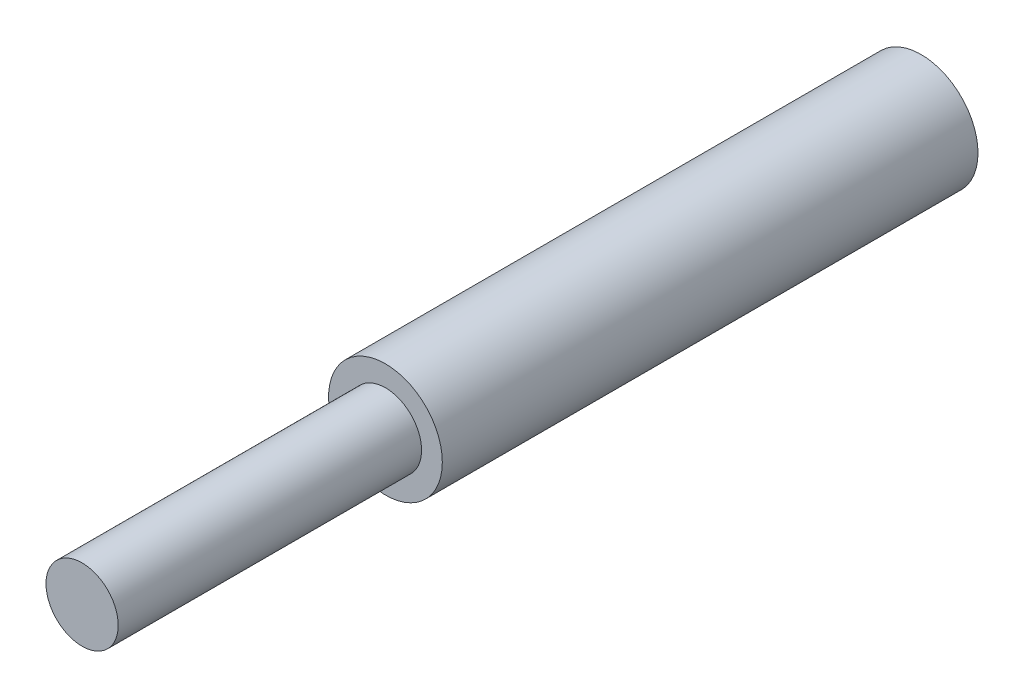
ISO-10303-21;
HEADER;
FILE_DESCRIPTION(('STEP AP214'),'2;1');
FILE_NAME('part.step','',(''),(''),'','','');
FILE_SCHEMA(('AUTOMOTIVE_DESIGN { 1 0 10303 214 1 1 1 1 }'));
ENDSEC;
DATA;
#1=APPLICATION_CONTEXT('core data for automotive mechanical design processes');
#2=APPLICATION_PROTOCOL_DEFINITION('international standard','automotive_design',2000,#1);
#3=PRODUCT_CONTEXT('',#1,'mechanical');
#4=PRODUCT('Part','Part','',(#3));
#5=PRODUCT_RELATED_PRODUCT_CATEGORY('part','',(#4));
#6=PRODUCT_DEFINITION_FORMATION('','',#4);
#7=PRODUCT_DEFINITION_CONTEXT('part definition',#1,'design');
#8=PRODUCT_DEFINITION('design','',#6,#7);
#9=PRODUCT_DEFINITION_SHAPE('','',#8);
#10=(LENGTH_UNIT() NAMED_UNIT(*) SI_UNIT(.MILLI.,.METRE.));
#11=(NAMED_UNIT(*) PLANE_ANGLE_UNIT() SI_UNIT($,.RADIAN.));
#12=(NAMED_UNIT(*) SI_UNIT($,.STERADIAN.) SOLID_ANGLE_UNIT());
#13=UNCERTAINTY_MEASURE_WITH_UNIT(LENGTH_MEASURE(1.E-05),#10,'distance_accuracy_value','');
#14=(GEOMETRIC_REPRESENTATION_CONTEXT(3) GLOBAL_UNCERTAINTY_ASSIGNED_CONTEXT((#13)) GLOBAL_UNIT_ASSIGNED_CONTEXT((#10,
#11,#12)) REPRESENTATION_CONTEXT('',''));
#15=CARTESIAN_POINT('',(0.,0.,0.));
#16=DIRECTION('',(0.,0.,1.));
#17=DIRECTION('',(1.,0.,0.));
#18=AXIS2_PLACEMENT_3D('',#15,#16,#17);
#19=CARTESIAN_POINT('',(-11.8336315363099,2.737218509567,37.084));
#20=DIRECTION('',(0.,0.,-1.));
#21=DIRECTION('',(-1.,0.,0.));
#22=AXIS2_PLACEMENT_3D('',#19,#20,#21);
#23=CYLINDRICAL_SURFACE('',#22,3.937);
#24=CARTESIAN_POINT('',(-11.8336315363099,2.737218509567,37.084));
#25=DIRECTION('',(0.,0.,1.));
#26=DIRECTION('',(1.,0.,0.));
#27=AXIS2_PLACEMENT_3D('',#24,#25,#26);
#28=CIRCLE('',#27,3.937);
#29=CARTESIAN_POINT('',(-7.89663153630987,2.737218509567,37.084));
#30=VERTEX_POINT('',#29);
#31=EDGE_CURVE('E38',#30,#30,#28,.T.);
#32=ORIENTED_EDGE('',*,*,#31,.F.);
#33=EDGE_LOOP('',(#32));
#34=FACE_BOUND('',#33,.T.);
#35=CARTESIAN_POINT('',(-11.8336315363099,2.737218509567,0.));
#36=DIRECTION('',(0.,0.,1.));
#37=DIRECTION('',(1.,0.,0.));
#38=AXIS2_PLACEMENT_3D('',#35,#36,#37);
#39=CIRCLE('',#38,3.937);
#40=CARTESIAN_POINT('',(-7.89663153630987,2.737218509567,0.));
#41=VERTEX_POINT('',#40);
#42=EDGE_CURVE('E34',#41,#41,#39,.T.);
#43=ORIENTED_EDGE('',*,*,#42,.T.);
#44=EDGE_LOOP('',(#43));
#45=FACE_BOUND('',#44,.T.);
#46=ADVANCED_FACE('F31',(#34,#45),#23,.T.);
#47=CARTESIAN_POINT('',(-11.8336315363099,2.737218509567,37.084));
#48=DIRECTION('',(0.,0.,1.));
#49=DIRECTION('',(1.,0.,0.));
#50=AXIS2_PLACEMENT_3D('',#47,#48,#49);
#51=PLANE('',#50);
#52=CARTESIAN_POINT('',(-11.8336315363099,2.737218509567,37.084));
#53=DIRECTION('',(0.,0.,1.));
#54=DIRECTION('',(1.,0.,0.));
#55=AXIS2_PLACEMENT_3D('',#52,#53,#54);
#56=CIRCLE('',#55,2.5);
#57=CARTESIAN_POINT('',(-14.3336315363099,2.737218509567,37.084));
#58=VERTEX_POINT('',#57);
#59=EDGE_CURVE('E10',#58,#58,#56,.T.);
#60=ORIENTED_EDGE('',*,*,#59,.F.);
#61=EDGE_LOOP('',(#60));
#62=FACE_BOUND('',#61,.T.);
#63=ORIENTED_EDGE('',*,*,#31,.T.);
#64=EDGE_LOOP('',(#63));
#65=FACE_BOUND('',#64,.T.);
#66=ADVANCED_FACE('F55',(#62,#65),#51,.T.);
#67=CARTESIAN_POINT('',(-11.8336315363099,2.737218509567,0.));
#68=DIRECTION('',(0.,0.,1.));
#69=DIRECTION('',(1.,0.,0.));
#70=AXIS2_PLACEMENT_3D('',#67,#68,#69);
#71=PLANE('',#70);
#72=ORIENTED_EDGE('',*,*,#42,.F.);
#73=EDGE_LOOP('',(#72));
#74=FACE_BOUND('',#73,.T.);
#75=ADVANCED_FACE('F52',(#74),#71,.F.);
#76=CARTESIAN_POINT('',(-11.8336315363099,2.737218509567,58.084));
#77=DIRECTION('',(0.,0.,-1.));
#78=DIRECTION('',(-1.,0.,0.));
#79=AXIS2_PLACEMENT_3D('',#76,#77,#78);
#80=CYLINDRICAL_SURFACE('',#79,2.5);
#81=CARTESIAN_POINT('',(-11.8336315363099,2.737218509567,58.084));
#82=DIRECTION('',(0.,0.,1.));
#83=DIRECTION('',(1.,0.,0.));
#84=AXIS2_PLACEMENT_3D('',#81,#82,#83);
#85=CIRCLE('',#84,2.5);
#86=CARTESIAN_POINT('',(-14.3336315363099,2.737218509567,58.084));
#87=VERTEX_POINT('',#86);
#88=EDGE_CURVE('E44',#87,#87,#85,.T.);
#89=CARTESIAN_POINT('',(-14.3336315363099,2.737218509567,58.084));
#90=CARTESIAN_POINT('',(-14.3336315363099,2.737218509567,57.86525));
#91=CARTESIAN_POINT('',(-14.3336315363099,2.737218509567,57.6465));
#92=CARTESIAN_POINT('',(-14.3336315363099,2.737218509567,57.209));
#93=CARTESIAN_POINT('',(-14.3336315363099,2.737218509567,56.99025));
#94=CARTESIAN_POINT('',(-14.3336315363099,2.737218509567,56.55275));
#95=CARTESIAN_POINT('',(-14.3336315363099,2.737218509567,56.334));
#96=CARTESIAN_POINT('',(-14.3336315363099,2.737218509567,55.8965));
#97=CARTESIAN_POINT('',(-14.3336315363099,2.737218509567,55.67775));
#98=CARTESIAN_POINT('',(-14.3336315363099,2.737218509567,55.24025));
#99=CARTESIAN_POINT('',(-14.3336315363099,2.737218509567,55.0215));
#100=CARTESIAN_POINT('',(-14.3336315363099,2.737218509567,54.584));
#101=CARTESIAN_POINT('',(-14.3336315363099,2.737218509567,54.36525));
#102=CARTESIAN_POINT('',(-14.3336315363099,2.737218509567,53.92775));
#103=CARTESIAN_POINT('',(-14.3336315363099,2.737218509567,53.709));
#104=CARTESIAN_POINT('',(-14.3336315363099,2.737218509567,53.2715));
#105=CARTESIAN_POINT('',(-14.3336315363099,2.737218509567,53.05275));
#106=CARTESIAN_POINT('',(-14.3336315363099,2.737218509567,52.61525));
#107=CARTESIAN_POINT('',(-14.3336315363099,2.737218509567,52.3965));
#108=CARTESIAN_POINT('',(-14.3336315363099,2.737218509567,51.959));
#109=CARTESIAN_POINT('',(-14.3336315363099,2.737218509567,51.74025));
#110=CARTESIAN_POINT('',(-14.3336315363099,2.737218509567,51.30275));
#111=CARTESIAN_POINT('',(-14.3336315363099,2.737218509567,51.084));
#112=CARTESIAN_POINT('',(-14.3336315363099,2.737218509567,50.6465));
#113=CARTESIAN_POINT('',(-14.3336315363099,2.737218509567,50.42775));
#114=CARTESIAN_POINT('',(-14.3336315363099,2.737218509567,49.99025));
#115=CARTESIAN_POINT('',(-14.3336315363099,2.737218509567,49.7715));
#116=CARTESIAN_POINT('',(-14.3336315363099,2.737218509567,49.334));
#117=CARTESIAN_POINT('',(-14.3336315363099,2.737218509567,49.11525));
#118=CARTESIAN_POINT('',(-14.3336315363099,2.737218509567,48.67775));
#119=CARTESIAN_POINT('',(-14.3336315363099,2.737218509567,48.459));
#120=CARTESIAN_POINT('',(-14.3336315363099,2.737218509567,48.0215));
#121=CARTESIAN_POINT('',(-14.3336315363099,2.737218509567,47.80275));
#122=CARTESIAN_POINT('',(-14.3336315363099,2.737218509567,47.36525));
#123=CARTESIAN_POINT('',(-14.3336315363099,2.737218509567,47.1465));
#124=CARTESIAN_POINT('',(-14.3336315363099,2.737218509567,46.709));
#125=CARTESIAN_POINT('',(-14.3336315363099,2.737218509567,46.49025));
#126=CARTESIAN_POINT('',(-14.3336315363099,2.737218509567,46.05275));
#127=CARTESIAN_POINT('',(-14.3336315363099,2.737218509567,45.834));
#128=CARTESIAN_POINT('',(-14.3336315363099,2.737218509567,45.3965));
#129=CARTESIAN_POINT('',(-14.3336315363099,2.737218509567,45.17775));
#130=CARTESIAN_POINT('',(-14.3336315363099,2.737218509567,44.74025));
#131=CARTESIAN_POINT('',(-14.3336315363099,2.737218509567,44.5215));
#132=CARTESIAN_POINT('',(-14.3336315363099,2.737218509567,44.084));
#133=CARTESIAN_POINT('',(-14.3336315363099,2.737218509567,43.86525));
#134=CARTESIAN_POINT('',(-14.3336315363099,2.737218509567,43.42775));
#135=CARTESIAN_POINT('',(-14.3336315363099,2.737218509567,43.209));
#136=CARTESIAN_POINT('',(-14.3336315363099,2.737218509567,42.7715));
#137=CARTESIAN_POINT('',(-14.3336315363099,2.737218509567,42.55275));
#138=CARTESIAN_POINT('',(-14.3336315363099,2.737218509567,42.11525));
#139=CARTESIAN_POINT('',(-14.3336315363099,2.737218509567,41.8965));
#140=CARTESIAN_POINT('',(-14.3336315363099,2.737218509567,41.459));
#141=CARTESIAN_POINT('',(-14.3336315363099,2.737218509567,41.24025));
#142=CARTESIAN_POINT('',(-14.3336315363099,2.737218509567,40.80275));
#143=CARTESIAN_POINT('',(-14.3336315363099,2.737218509567,40.584));
#144=CARTESIAN_POINT('',(-14.3336315363099,2.737218509567,40.1465));
#145=CARTESIAN_POINT('',(-14.3336315363099,2.737218509567,39.92775));
#146=CARTESIAN_POINT('',(-14.3336315363099,2.737218509567,39.49025));
#147=CARTESIAN_POINT('',(-14.3336315363099,2.737218509567,39.2715));
#148=CARTESIAN_POINT('',(-14.3336315363099,2.737218509567,38.834));
#149=CARTESIAN_POINT('',(-14.3336315363099,2.737218509567,38.61525));
#150=CARTESIAN_POINT('',(-14.3336315363099,2.737218509567,38.17775));
#151=CARTESIAN_POINT('',(-14.3336315363099,2.737218509567,37.959));
#152=CARTESIAN_POINT('',(-14.3336315363099,2.737218509567,37.5215));
#153=CARTESIAN_POINT('',(-14.3336315363099,2.737218509567,37.30275));
#154=CARTESIAN_POINT('',(-14.3336315363099,2.737218509567,37.084));
#155=B_SPLINE_CURVE_WITH_KNOTS('',3,(#89,#90,#91,#92,#93,#94,#95,#96,#97,#98,#99,#100,#101,#102,
#103,#104,#105,#106,#107,#108,#109,#110,#111,#112,#113,#114,#115,#116,#117,#118,#119,#120,#121,
#122,#123,#124,#125,#126,#127,#128,#129,#130,#131,#132,#133,#134,#135,#136,#137,#138,#139,#140,
#141,#142,#143,#144,#145,#146,#147,#148,#149,#150,#151,#152,#153,#154),.UNSPECIFIED.,.F.,.F.,(4,
2,2,2,2,2,2,2,2,2,2,2,2,2,2,2,2,2,2,2,2,2,2,2,2,2,2,2,2,2,2,2,4),(0.,0.656249999999997,
1.31249999999999,1.96875,2.625,3.28125,3.9375,4.59374999999999,5.25,5.90624999999999,6.5625,
7.21875,7.87499999999999,8.53125,9.18749999999999,9.84374999999999,10.5,11.15625,11.8125,
12.46875,13.125,13.78125,14.4375,15.09375,15.75,16.40625,17.0625,17.71875,18.375,19.03125,
19.6875,20.34375,21.),.UNSPECIFIED.);
#156=EDGE_CURVE('BSEAM54',#87,#58,#155,.T.);
#157=ORIENTED_EDGE('',*,*,#88,.F.);
#158=ORIENTED_EDGE('',*,*,#59,.T.);
#159=ORIENTED_EDGE('',*,*,#156,.T.);
#160=ORIENTED_EDGE('',*,*,#156,.F.);
#161=EDGE_LOOP('',(#157,#159,#158,#160));
#162=FACE_BOUND('',#161,.T.);
#163=ADVANCED_FACE('F54',(#162),#80,.T.);
#164=CARTESIAN_POINT('',(-11.8336315363099,2.737218509567,58.084));
#165=DIRECTION('',(0.,0.,1.));
#166=DIRECTION('',(1.,0.,0.));
#167=AXIS2_PLACEMENT_3D('',#164,#165,#166);
#168=PLANE('',#167);
#169=ORIENTED_EDGE('',*,*,#88,.T.);
#170=EDGE_LOOP('',(#169));
#171=FACE_BOUND('',#170,.T.);
#172=ADVANCED_FACE('F60',(#171),#168,.T.);
#173=CLOSED_SHELL('',(#46,#66,#75,#163,#172));
#174=MANIFOLD_SOLID_BREP('B2',#173);
#175=ADVANCED_BREP_SHAPE_REPRESENTATION('',(#18,#174),#14);
#176=SHAPE_DEFINITION_REPRESENTATION(#9,#175);
ENDSEC;
END-ISO-10303-21;
